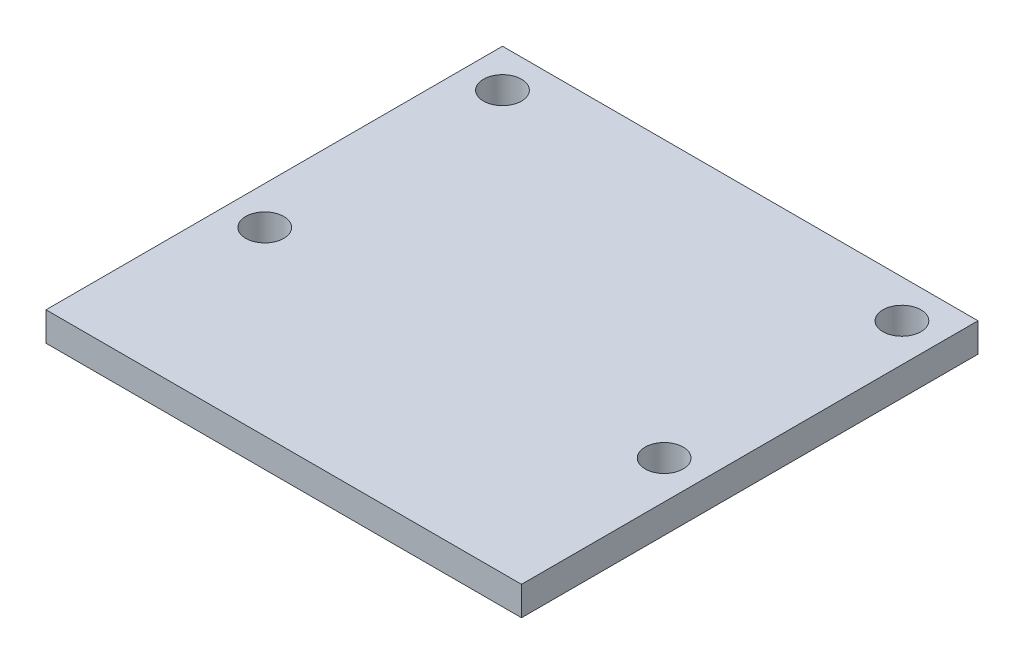
ISO-10303-21;
HEADER;
FILE_DESCRIPTION(('STEP AP214'),'2;1');
FILE_NAME('part.step','',(''),(''),'','','');
FILE_SCHEMA(('AUTOMOTIVE_DESIGN { 1 0 10303 214 1 1 1 1 }'));
ENDSEC;
DATA;
#1=APPLICATION_CONTEXT('core data for automotive mechanical design processes');
#2=APPLICATION_PROTOCOL_DEFINITION('international standard','automotive_design',2000,#1);
#3=PRODUCT_CONTEXT('',#1,'mechanical');
#4=PRODUCT('Part','Part','',(#3));
#5=PRODUCT_RELATED_PRODUCT_CATEGORY('part','',(#4));
#6=PRODUCT_DEFINITION_FORMATION('','',#4);
#7=PRODUCT_DEFINITION_CONTEXT('part definition',#1,'design');
#8=PRODUCT_DEFINITION('design','',#6,#7);
#9=PRODUCT_DEFINITION_SHAPE('','',#8);
#10=(LENGTH_UNIT() NAMED_UNIT(*) SI_UNIT(.MILLI.,.METRE.));
#11=(NAMED_UNIT(*) PLANE_ANGLE_UNIT() SI_UNIT($,.RADIAN.));
#12=(NAMED_UNIT(*) SI_UNIT($,.STERADIAN.) SOLID_ANGLE_UNIT());
#13=UNCERTAINTY_MEASURE_WITH_UNIT(LENGTH_MEASURE(1.E-05),#10,'distance_accuracy_value','');
#14=(GEOMETRIC_REPRESENTATION_CONTEXT(3) GLOBAL_UNCERTAINTY_ASSIGNED_CONTEXT((#13)) GLOBAL_UNIT_ASSIGNED_CONTEXT((#10,
#11,#12)) REPRESENTATION_CONTEXT('',''));
#15=CARTESIAN_POINT('',(0.,0.,0.));
#16=DIRECTION('',(0.,0.,1.));
#17=DIRECTION('',(1.,0.,0.));
#18=AXIS2_PLACEMENT_3D('',#15,#16,#17);
#19=CARTESIAN_POINT('',(0.,1.524,0.));
#20=DIRECTION('',(0.,-1.,0.));
#21=DIRECTION('',(0.,0.,-1.));
#22=AXIS2_PLACEMENT_3D('',#19,#20,#21);
#23=PLANE('',#22);
#24=DIRECTION('',(0.,0.,1.));
#25=VECTOR('',#24,1.);
#26=CARTESIAN_POINT('',(0.,1.524,0.));
#27=LINE('',#26,#25);
#28=CARTESIAN_POINT('',(0.,1.524,-24.));
#29=VERTEX_POINT('',#28);
#30=CARTESIAN_POINT('',(0.,1.524,0.));
#31=VERTEX_POINT('',#30);
#32=EDGE_CURVE('E84',#29,#31,#27,.T.);
#33=ORIENTED_EDGE('',*,*,#32,.T.);
#34=DIRECTION('',(1.,0.,0.));
#35=VECTOR('',#34,1.);
#36=CARTESIAN_POINT('',(0.,1.524,0.));
#37=LINE('',#36,#35);
#38=CARTESIAN_POINT('',(25.,1.524,0.));
#39=VERTEX_POINT('',#38);
#40=EDGE_CURVE('E79',#31,#39,#37,.T.);
#41=ORIENTED_EDGE('',*,*,#40,.T.);
#42=DIRECTION('',(0.,0.,-1.));
#43=VECTOR('',#42,1.);
#44=CARTESIAN_POINT('',(25.,1.524,0.));
#45=LINE('',#44,#43);
#46=CARTESIAN_POINT('',(25.,1.524,-24.));
#47=VERTEX_POINT('',#46);
#48=EDGE_CURVE('E82',#39,#47,#45,.T.);
#49=ORIENTED_EDGE('',*,*,#48,.T.);
#50=DIRECTION('',(-1.,0.,0.));
#51=VECTOR('',#50,1.);
#52=CARTESIAN_POINT('',(0.,1.524,-24.));
#53=LINE('',#52,#51);
#54=EDGE_CURVE('E49',#47,#29,#53,.T.);
#55=ORIENTED_EDGE('',*,*,#54,.T.);
#56=EDGE_LOOP('',(#33,#41,#49,#55));
#57=FACE_BOUND('',#56,.T.);
#58=CARTESIAN_POINT('',(2.,1.524,-22.));
#59=DIRECTION('',(0.,1.,0.));
#60=DIRECTION('',(0.,0.,1.));
#61=AXIS2_PLACEMENT_3D('',#58,#59,#60);
#62=CIRCLE('',#61,1.);
#63=CARTESIAN_POINT('',(2.,1.524,-23.));
#64=VERTEX_POINT('',#63);
#65=EDGE_CURVE('E99',#64,#64,#62,.T.);
#66=ORIENTED_EDGE('',*,*,#65,.F.);
#67=EDGE_LOOP('',(#66));
#68=FACE_BOUND('',#67,.T.);
#69=CARTESIAN_POINT('',(23.,1.524,-22.));
#70=DIRECTION('',(0.,1.,0.));
#71=DIRECTION('',(0.,0.,1.));
#72=AXIS2_PLACEMENT_3D('',#69,#70,#71);
#73=CIRCLE('',#72,1.);
#74=CARTESIAN_POINT('',(23.,1.524,-23.));
#75=VERTEX_POINT('',#74);
#76=EDGE_CURVE('E114',#75,#75,#73,.T.);
#77=ORIENTED_EDGE('',*,*,#76,.F.);
#78=EDGE_LOOP('',(#77));
#79=FACE_BOUND('',#78,.T.);
#80=CARTESIAN_POINT('',(23.,1.524,-9.5));
#81=DIRECTION('',(0.,1.,0.));
#82=DIRECTION('',(0.,0.,1.));
#83=AXIS2_PLACEMENT_3D('',#80,#81,#82);
#84=CIRCLE('',#83,1.);
#85=CARTESIAN_POINT('',(23.,1.524,-10.5));
#86=VERTEX_POINT('',#85);
#87=EDGE_CURVE('E120',#86,#86,#84,.T.);
#88=ORIENTED_EDGE('',*,*,#87,.F.);
#89=EDGE_LOOP('',(#88));
#90=FACE_BOUND('',#89,.T.);
#91=CARTESIAN_POINT('',(2.,1.524,-9.5));
#92=DIRECTION('',(0.,1.,0.));
#93=DIRECTION('',(0.,0.,1.));
#94=AXIS2_PLACEMENT_3D('',#91,#92,#93);
#95=CIRCLE('',#94,1.);
#96=CARTESIAN_POINT('',(2.,1.524,-10.5));
#97=VERTEX_POINT('',#96);
#98=EDGE_CURVE('E126',#97,#97,#95,.T.);
#99=ORIENTED_EDGE('',*,*,#98,.F.);
#100=EDGE_LOOP('',(#99));
#101=FACE_BOUND('',#100,.T.);
#102=ADVANCED_FACE('F32',(#57,#68,#79,#90,#101),#23,.F.);
#103=CARTESIAN_POINT('',(0.,0.,0.));
#104=DIRECTION('',(0.,-1.,0.));
#105=DIRECTION('',(0.,0.,-1.));
#106=AXIS2_PLACEMENT_3D('',#103,#104,#105);
#107=PLANE('',#106);
#108=CARTESIAN_POINT('',(23.,0.,-9.5));
#109=DIRECTION('',(0.,1.,0.));
#110=DIRECTION('',(0.,0.,1.));
#111=AXIS2_PLACEMENT_3D('',#108,#109,#110);
#112=CIRCLE('',#111,1.);
#113=CARTESIAN_POINT('',(23.,0.,-10.5));
#114=VERTEX_POINT('',#113);
#115=EDGE_CURVE('E123',#114,#114,#112,.T.);
#116=ORIENTED_EDGE('',*,*,#115,.T.);
#117=EDGE_LOOP('',(#116));
#118=FACE_BOUND('',#117,.T.);
#119=CARTESIAN_POINT('',(2.,0.,-22.));
#120=DIRECTION('',(0.,1.,0.));
#121=DIRECTION('',(0.,0.,1.));
#122=AXIS2_PLACEMENT_3D('',#119,#120,#121);
#123=CIRCLE('',#122,1.);
#124=CARTESIAN_POINT('',(2.,0.,-23.));
#125=VERTEX_POINT('',#124);
#126=EDGE_CURVE('E111',#125,#125,#123,.T.);
#127=ORIENTED_EDGE('',*,*,#126,.T.);
#128=EDGE_LOOP('',(#127));
#129=FACE_BOUND('',#128,.T.);
#130=DIRECTION('',(0.,0.,1.));
#131=VECTOR('',#130,1.);
#132=CARTESIAN_POINT('',(0.,0.,0.));
#133=LINE('',#132,#131);
#134=CARTESIAN_POINT('',(0.,0.,-24.));
#135=VERTEX_POINT('',#134);
#136=CARTESIAN_POINT('',(0.,0.,0.));
#137=VERTEX_POINT('',#136);
#138=EDGE_CURVE('E96',#135,#137,#133,.T.);
#139=ORIENTED_EDGE('',*,*,#138,.F.);
#140=DIRECTION('',(-1.,0.,0.));
#141=VECTOR('',#140,1.);
#142=CARTESIAN_POINT('',(0.,0.,-24.));
#143=LINE('',#142,#141);
#144=CARTESIAN_POINT('',(25.,0.,-24.));
#145=VERTEX_POINT('',#144);
#146=EDGE_CURVE('E72',#145,#135,#143,.T.);
#147=ORIENTED_EDGE('',*,*,#146,.F.);
#148=DIRECTION('',(0.,0.,-1.));
#149=VECTOR('',#148,1.);
#150=CARTESIAN_POINT('',(25.,0.,0.));
#151=LINE('',#150,#149);
#152=CARTESIAN_POINT('',(25.,0.,0.));
#153=VERTEX_POINT('',#152);
#154=EDGE_CURVE('E66',#153,#145,#151,.T.);
#155=ORIENTED_EDGE('',*,*,#154,.F.);
#156=DIRECTION('',(1.,0.,0.));
#157=VECTOR('',#156,1.);
#158=CARTESIAN_POINT('',(0.,0.,0.));
#159=LINE('',#158,#157);
#160=EDGE_CURVE('E88',#137,#153,#159,.T.);
#161=ORIENTED_EDGE('',*,*,#160,.F.);
#162=EDGE_LOOP('',(#139,#147,#155,#161));
#163=FACE_BOUND('',#162,.T.);
#164=CARTESIAN_POINT('',(23.,0.,-22.));
#165=DIRECTION('',(0.,1.,0.));
#166=DIRECTION('',(0.,0.,1.));
#167=AXIS2_PLACEMENT_3D('',#164,#165,#166);
#168=CIRCLE('',#167,1.);
#169=CARTESIAN_POINT('',(23.,0.,-23.));
#170=VERTEX_POINT('',#169);
#171=EDGE_CURVE('E117',#170,#170,#168,.T.);
#172=ORIENTED_EDGE('',*,*,#171,.T.);
#173=EDGE_LOOP('',(#172));
#174=FACE_BOUND('',#173,.T.);
#175=CARTESIAN_POINT('',(2.,0.,-9.5));
#176=DIRECTION('',(0.,1.,0.));
#177=DIRECTION('',(0.,0.,1.));
#178=AXIS2_PLACEMENT_3D('',#175,#176,#177);
#179=CIRCLE('',#178,1.);
#180=CARTESIAN_POINT('',(2.,0.,-10.5));
#181=VERTEX_POINT('',#180);
#182=EDGE_CURVE('E129',#181,#181,#179,.T.);
#183=ORIENTED_EDGE('',*,*,#182,.T.);
#184=EDGE_LOOP('',(#183));
#185=FACE_BOUND('',#184,.T.);
#186=ADVANCED_FACE('F107',(#118,#129,#163,#174,#185),#107,.T.);
#187=CARTESIAN_POINT('',(0.,1.524,0.));
#188=DIRECTION('',(1.,0.,0.));
#189=DIRECTION('',(0.,0.,-1.));
#190=AXIS2_PLACEMENT_3D('',#187,#188,#189);
#191=PLANE('',#190);
#192=ORIENTED_EDGE('',*,*,#138,.T.);
#193=DIRECTION('',(0.,-1.,0.));
#194=VECTOR('',#193,1.);
#195=CARTESIAN_POINT('',(0.,1.524,0.));
#196=LINE('',#195,#194);
#197=EDGE_CURVE('E11',#31,#137,#196,.T.);
#198=ORIENTED_EDGE('',*,*,#197,.F.);
#199=ORIENTED_EDGE('',*,*,#32,.F.);
#200=DIRECTION('',(0.,-1.,0.));
#201=VECTOR('',#200,1.);
#202=CARTESIAN_POINT('',(0.,1.524,-24.));
#203=LINE('',#202,#201);
#204=EDGE_CURVE('E92',#29,#135,#203,.T.);
#205=ORIENTED_EDGE('',*,*,#204,.T.);
#206=EDGE_LOOP('',(#192,#198,#199,#205));
#207=FACE_BOUND('',#206,.T.);
#208=ADVANCED_FACE('F34',(#207),#191,.F.);
#209=CARTESIAN_POINT('',(0.,1.524,0.));
#210=DIRECTION('',(0.,0.,-1.));
#211=DIRECTION('',(-1.,0.,0.));
#212=AXIS2_PLACEMENT_3D('',#209,#210,#211);
#213=PLANE('',#212);
#214=ORIENTED_EDGE('',*,*,#160,.T.);
#215=DIRECTION('',(0.,-1.,0.));
#216=VECTOR('',#215,1.);
#217=CARTESIAN_POINT('',(25.,1.524,0.));
#218=LINE('',#217,#216);
#219=EDGE_CURVE('E41',#39,#153,#218,.T.);
#220=ORIENTED_EDGE('',*,*,#219,.F.);
#221=ORIENTED_EDGE('',*,*,#40,.F.);
#222=ORIENTED_EDGE('',*,*,#197,.T.);
#223=EDGE_LOOP('',(#214,#220,#221,#222));
#224=FACE_BOUND('',#223,.T.);
#225=ADVANCED_FACE('F87',(#224),#213,.F.);
#226=CARTESIAN_POINT('',(25.,1.524,0.));
#227=DIRECTION('',(-1.,0.,0.));
#228=DIRECTION('',(0.,0.,1.));
#229=AXIS2_PLACEMENT_3D('',#226,#227,#228);
#230=PLANE('',#229);
#231=ORIENTED_EDGE('',*,*,#154,.T.);
#232=DIRECTION('',(0.,-1.,0.));
#233=VECTOR('',#232,1.);
#234=CARTESIAN_POINT('',(25.,1.524,-24.));
#235=LINE('',#234,#233);
#236=EDGE_CURVE('E89',#47,#145,#235,.T.);
#237=ORIENTED_EDGE('',*,*,#236,.F.);
#238=ORIENTED_EDGE('',*,*,#48,.F.);
#239=ORIENTED_EDGE('',*,*,#219,.T.);
#240=EDGE_LOOP('',(#231,#237,#238,#239));
#241=FACE_BOUND('',#240,.T.);
#242=ADVANCED_FACE('F90',(#241),#230,.F.);
#243=CARTESIAN_POINT('',(0.,1.524,-24.));
#244=DIRECTION('',(0.,0.,1.));
#245=DIRECTION('',(1.,0.,0.));
#246=AXIS2_PLACEMENT_3D('',#243,#244,#245);
#247=PLANE('',#246);
#248=ORIENTED_EDGE('',*,*,#146,.T.);
#249=ORIENTED_EDGE('',*,*,#204,.F.);
#250=ORIENTED_EDGE('',*,*,#54,.F.);
#251=ORIENTED_EDGE('',*,*,#236,.T.);
#252=EDGE_LOOP('',(#248,#249,#250,#251));
#253=FACE_BOUND('',#252,.T.);
#254=ADVANCED_FACE('F104',(#253),#247,.F.);
#255=CARTESIAN_POINT('',(2.,1.524,-22.));
#256=DIRECTION('',(0.,-1.,0.));
#257=DIRECTION('',(0.,0.,-1.));
#258=AXIS2_PLACEMENT_3D('',#255,#256,#257);
#259=CYLINDRICAL_SURFACE('',#258,1.);
#260=CARTESIAN_POINT('',(2.,1.524,-23.));
#261=CARTESIAN_POINT('',(2.,1.508125,-23.));
#262=CARTESIAN_POINT('',(2.,1.49225,-23.));
#263=CARTESIAN_POINT('',(2.,1.4605,-23.));
#264=CARTESIAN_POINT('',(2.,1.444625,-23.));
#265=CARTESIAN_POINT('',(2.,1.412875,-23.));
#266=CARTESIAN_POINT('',(2.,1.397,-23.));
#267=CARTESIAN_POINT('',(2.,1.36525,-23.));
#268=CARTESIAN_POINT('',(2.,1.349375,-23.));
#269=CARTESIAN_POINT('',(2.,1.317625,-23.));
#270=CARTESIAN_POINT('',(2.,1.30175,-23.));
#271=CARTESIAN_POINT('',(2.,1.27,-23.));
#272=CARTESIAN_POINT('',(2.,1.254125,-23.));
#273=CARTESIAN_POINT('',(2.,1.222375,-23.));
#274=CARTESIAN_POINT('',(2.,1.2065,-23.));
#275=CARTESIAN_POINT('',(2.,1.17475,-23.));
#276=CARTESIAN_POINT('',(2.,1.158875,-23.));
#277=CARTESIAN_POINT('',(2.,1.127125,-23.));
#278=CARTESIAN_POINT('',(2.,1.11125,-23.));
#279=CARTESIAN_POINT('',(2.,1.0795,-23.));
#280=CARTESIAN_POINT('',(2.,1.063625,-23.));
#281=CARTESIAN_POINT('',(2.,1.031875,-23.));
#282=CARTESIAN_POINT('',(2.,1.016,-23.));
#283=CARTESIAN_POINT('',(2.,0.98425,-23.));
#284=CARTESIAN_POINT('',(2.,0.968375,-23.));
#285=CARTESIAN_POINT('',(2.,0.936625,-23.));
#286=CARTESIAN_POINT('',(2.,0.92075,-23.));
#287=CARTESIAN_POINT('',(2.,0.889,-23.));
#288=CARTESIAN_POINT('',(2.,0.873125,-23.));
#289=CARTESIAN_POINT('',(2.,0.841375,-23.));
#290=CARTESIAN_POINT('',(2.,0.8255,-23.));
#291=CARTESIAN_POINT('',(2.,0.79375,-23.));
#292=CARTESIAN_POINT('',(2.,0.777875,-23.));
#293=CARTESIAN_POINT('',(2.,0.746125,-23.));
#294=CARTESIAN_POINT('',(2.,0.73025,-23.));
#295=CARTESIAN_POINT('',(2.,0.6985,-23.));
#296=CARTESIAN_POINT('',(2.,0.682625,-23.));
#297=CARTESIAN_POINT('',(2.,0.650875,-23.));
#298=CARTESIAN_POINT('',(2.,0.635,-23.));
#299=CARTESIAN_POINT('',(2.,0.60325,-23.));
#300=CARTESIAN_POINT('',(2.,0.587375,-23.));
#301=CARTESIAN_POINT('',(2.,0.555625,-23.));
#302=CARTESIAN_POINT('',(2.,0.53975,-23.));
#303=CARTESIAN_POINT('',(2.,0.508,-23.));
#304=CARTESIAN_POINT('',(2.,0.492125,-23.));
#305=CARTESIAN_POINT('',(2.,0.460375,-23.));
#306=CARTESIAN_POINT('',(2.,0.4445,-23.));
#307=CARTESIAN_POINT('',(2.,0.41275,-23.));
#308=CARTESIAN_POINT('',(2.,0.396875,-23.));
#309=CARTESIAN_POINT('',(2.,0.365125,-23.));
#310=CARTESIAN_POINT('',(2.,0.34925,-23.));
#311=CARTESIAN_POINT('',(2.,0.3175,-23.));
#312=CARTESIAN_POINT('',(2.,0.301625,-23.));
#313=CARTESIAN_POINT('',(2.,0.269875,-23.));
#314=CARTESIAN_POINT('',(2.,0.254,-23.));
#315=CARTESIAN_POINT('',(2.,0.22225,-23.));
#316=CARTESIAN_POINT('',(2.,0.206375,-23.));
#317=CARTESIAN_POINT('',(2.,0.174625,-23.));
#318=CARTESIAN_POINT('',(2.,0.15875,-23.));
#319=CARTESIAN_POINT('',(2.,0.127,-23.));
#320=CARTESIAN_POINT('',(2.,0.111125,-23.));
#321=CARTESIAN_POINT('',(2.,0.079375,-23.));
#322=CARTESIAN_POINT('',(2.,0.0635,-23.));
#323=CARTESIAN_POINT('',(2.,0.0317499999999999,-23.));
#324=CARTESIAN_POINT('',(2.,0.015875,-23.));
#325=CARTESIAN_POINT('',(2.,0.,-23.));
#326=B_SPLINE_CURVE_WITH_KNOTS('',3,(#260,#261,#262,#263,#264,#265,#266,#267,#268,#269,#270,
#271,#272,#273,#274,#275,#276,#277,#278,#279,#280,#281,#282,#283,#284,#285,#286,#287,#288,#289,
#290,#291,#292,#293,#294,#295,#296,#297,#298,#299,#300,#301,#302,#303,#304,#305,#306,#307,#308,
#309,#310,#311,#312,#313,#314,#315,#316,#317,#318,#319,#320,#321,#322,#323,#324,#325),
.UNSPECIFIED.,.F.,.F.,(4,2,2,2,2,2,2,2,2,2,2,2,2,2,2,2,2,2,2,2,2,2,2,2,2,2,2,2,2,2,2,2,4),(0.,
0.0476249999999999,0.0952499999999998,0.142875,0.1905,0.238125,0.28575,0.333375,0.381,0.428625,
0.47625,0.523875,0.5715,0.619125,0.66675,0.714375,0.762,0.809625,0.85725,0.904875,0.9525,
1.000125,1.04775,1.095375,1.143,1.190625,1.23825,1.285875,1.3335,1.381125,1.42875,1.476375,
1.524),.UNSPECIFIED.);
#327=EDGE_CURVE('BSEAM146',#64,#125,#326,.T.);
#328=ORIENTED_EDGE('',*,*,#65,.T.);
#329=ORIENTED_EDGE('',*,*,#126,.F.);
#330=ORIENTED_EDGE('',*,*,#327,.T.);
#331=ORIENTED_EDGE('',*,*,#327,.F.);
#332=EDGE_LOOP('',(#328,#330,#329,#331));
#333=FACE_BOUND('',#332,.T.);
#334=ADVANCED_FACE('F146',(#333),#259,.F.);
#335=CARTESIAN_POINT('',(23.,1.524,-22.));
#336=DIRECTION('',(0.,-1.,0.));
#337=DIRECTION('',(0.,0.,-1.));
#338=AXIS2_PLACEMENT_3D('',#335,#336,#337);
#339=CYLINDRICAL_SURFACE('',#338,1.);
#340=CARTESIAN_POINT('',(23.,1.524,-23.));
#341=CARTESIAN_POINT('',(23.,1.508125,-23.));
#342=CARTESIAN_POINT('',(23.,1.49225,-23.));
#343=CARTESIAN_POINT('',(23.,1.4605,-23.));
#344=CARTESIAN_POINT('',(23.,1.444625,-23.));
#345=CARTESIAN_POINT('',(23.,1.412875,-23.));
#346=CARTESIAN_POINT('',(23.,1.397,-23.));
#347=CARTESIAN_POINT('',(23.,1.36525,-23.));
#348=CARTESIAN_POINT('',(23.,1.349375,-23.));
#349=CARTESIAN_POINT('',(23.,1.317625,-23.));
#350=CARTESIAN_POINT('',(23.,1.30175,-23.));
#351=CARTESIAN_POINT('',(23.,1.27,-23.));
#352=CARTESIAN_POINT('',(23.,1.254125,-23.));
#353=CARTESIAN_POINT('',(23.,1.222375,-23.));
#354=CARTESIAN_POINT('',(23.,1.2065,-23.));
#355=CARTESIAN_POINT('',(23.,1.17475,-23.));
#356=CARTESIAN_POINT('',(23.,1.158875,-23.));
#357=CARTESIAN_POINT('',(23.,1.127125,-23.));
#358=CARTESIAN_POINT('',(23.,1.11125,-23.));
#359=CARTESIAN_POINT('',(23.,1.0795,-23.));
#360=CARTESIAN_POINT('',(23.,1.063625,-23.));
#361=CARTESIAN_POINT('',(23.,1.031875,-23.));
#362=CARTESIAN_POINT('',(23.,1.016,-23.));
#363=CARTESIAN_POINT('',(23.,0.98425,-23.));
#364=CARTESIAN_POINT('',(23.,0.968375,-23.));
#365=CARTESIAN_POINT('',(23.,0.936625,-23.));
#366=CARTESIAN_POINT('',(23.,0.92075,-23.));
#367=CARTESIAN_POINT('',(23.,0.889,-23.));
#368=CARTESIAN_POINT('',(23.,0.873125,-23.));
#369=CARTESIAN_POINT('',(23.,0.841375,-23.));
#370=CARTESIAN_POINT('',(23.,0.8255,-23.));
#371=CARTESIAN_POINT('',(23.,0.79375,-23.));
#372=CARTESIAN_POINT('',(23.,0.777875,-23.));
#373=CARTESIAN_POINT('',(23.,0.746125,-23.));
#374=CARTESIAN_POINT('',(23.,0.73025,-23.));
#375=CARTESIAN_POINT('',(23.,0.6985,-23.));
#376=CARTESIAN_POINT('',(23.,0.682625,-23.));
#377=CARTESIAN_POINT('',(23.,0.650875,-23.));
#378=CARTESIAN_POINT('',(23.,0.635,-23.));
#379=CARTESIAN_POINT('',(23.,0.60325,-23.));
#380=CARTESIAN_POINT('',(23.,0.587375,-23.));
#381=CARTESIAN_POINT('',(23.,0.555625,-23.));
#382=CARTESIAN_POINT('',(23.,0.53975,-23.));
#383=CARTESIAN_POINT('',(23.,0.508,-23.));
#384=CARTESIAN_POINT('',(23.,0.492125,-23.));
#385=CARTESIAN_POINT('',(23.,0.460375,-23.));
#386=CARTESIAN_POINT('',(23.,0.4445,-23.));
#387=CARTESIAN_POINT('',(23.,0.41275,-23.));
#388=CARTESIAN_POINT('',(23.,0.396875,-23.));
#389=CARTESIAN_POINT('',(23.,0.365125,-23.));
#390=CARTESIAN_POINT('',(23.,0.34925,-23.));
#391=CARTESIAN_POINT('',(23.,0.3175,-23.));
#392=CARTESIAN_POINT('',(23.,0.301625,-23.));
#393=CARTESIAN_POINT('',(23.,0.269875,-23.));
#394=CARTESIAN_POINT('',(23.,0.254,-23.));
#395=CARTESIAN_POINT('',(23.,0.22225,-23.));
#396=CARTESIAN_POINT('',(23.,0.206375,-23.));
#397=CARTESIAN_POINT('',(23.,0.174625,-23.));
#398=CARTESIAN_POINT('',(23.,0.15875,-23.));
#399=CARTESIAN_POINT('',(23.,0.127,-23.));
#400=CARTESIAN_POINT('',(23.,0.111125,-23.));
#401=CARTESIAN_POINT('',(23.,0.079375,-23.));
#402=CARTESIAN_POINT('',(23.,0.0635,-23.));
#403=CARTESIAN_POINT('',(23.,0.0317499999999999,-23.));
#404=CARTESIAN_POINT('',(23.,0.015875,-23.));
#405=CARTESIAN_POINT('',(23.,0.,-23.));
#406=B_SPLINE_CURVE_WITH_KNOTS('',3,(#340,#341,#342,#343,#344,#345,#346,#347,#348,#349,#350,
#351,#352,#353,#354,#355,#356,#357,#358,#359,#360,#361,#362,#363,#364,#365,#366,#367,#368,#369,
#370,#371,#372,#373,#374,#375,#376,#377,#378,#379,#380,#381,#382,#383,#384,#385,#386,#387,#388,
#389,#390,#391,#392,#393,#394,#395,#396,#397,#398,#399,#400,#401,#402,#403,#404,#405),
.UNSPECIFIED.,.F.,.F.,(4,2,2,2,2,2,2,2,2,2,2,2,2,2,2,2,2,2,2,2,2,2,2,2,2,2,2,2,2,2,2,2,4),(0.,
0.0476249999999999,0.0952499999999998,0.142875,0.1905,0.238125,0.28575,0.333375,0.381,0.428625,
0.47625,0.523875,0.5715,0.619125,0.66675,0.714375,0.762,0.809625,0.85725,0.904875,0.9525,
1.000125,1.04775,1.095375,1.143,1.190625,1.23825,1.285875,1.3335,1.381125,1.42875,1.476375,
1.524),.UNSPECIFIED.);
#407=EDGE_CURVE('BSEAM192',#75,#170,#406,.T.);
#408=ORIENTED_EDGE('',*,*,#76,.T.);
#409=ORIENTED_EDGE('',*,*,#171,.F.);
#410=ORIENTED_EDGE('',*,*,#407,.T.);
#411=ORIENTED_EDGE('',*,*,#407,.F.);
#412=EDGE_LOOP('',(#408,#410,#409,#411));
#413=FACE_BOUND('',#412,.T.);
#414=ADVANCED_FACE('F192',(#413),#339,.F.);
#415=CARTESIAN_POINT('',(23.,1.524,-9.5));
#416=DIRECTION('',(0.,-1.,0.));
#417=DIRECTION('',(0.,0.,-1.));
#418=AXIS2_PLACEMENT_3D('',#415,#416,#417);
#419=CYLINDRICAL_SURFACE('',#418,1.);
#420=CARTESIAN_POINT('',(23.,1.524,-10.5));
#421=CARTESIAN_POINT('',(23.,1.508125,-10.5));
#422=CARTESIAN_POINT('',(23.,1.49225,-10.5));
#423=CARTESIAN_POINT('',(23.,1.4605,-10.5));
#424=CARTESIAN_POINT('',(23.,1.444625,-10.5));
#425=CARTESIAN_POINT('',(23.,1.412875,-10.5));
#426=CARTESIAN_POINT('',(23.,1.397,-10.5));
#427=CARTESIAN_POINT('',(23.,1.36525,-10.5));
#428=CARTESIAN_POINT('',(23.,1.349375,-10.5));
#429=CARTESIAN_POINT('',(23.,1.317625,-10.5));
#430=CARTESIAN_POINT('',(23.,1.30175,-10.5));
#431=CARTESIAN_POINT('',(23.,1.27,-10.5));
#432=CARTESIAN_POINT('',(23.,1.254125,-10.5));
#433=CARTESIAN_POINT('',(23.,1.222375,-10.5));
#434=CARTESIAN_POINT('',(23.,1.2065,-10.5));
#435=CARTESIAN_POINT('',(23.,1.17475,-10.5));
#436=CARTESIAN_POINT('',(23.,1.158875,-10.5));
#437=CARTESIAN_POINT('',(23.,1.127125,-10.5));
#438=CARTESIAN_POINT('',(23.,1.11125,-10.5));
#439=CARTESIAN_POINT('',(23.,1.0795,-10.5));
#440=CARTESIAN_POINT('',(23.,1.063625,-10.5));
#441=CARTESIAN_POINT('',(23.,1.031875,-10.5));
#442=CARTESIAN_POINT('',(23.,1.016,-10.5));
#443=CARTESIAN_POINT('',(23.,0.98425,-10.5));
#444=CARTESIAN_POINT('',(23.,0.968375,-10.5));
#445=CARTESIAN_POINT('',(23.,0.936625,-10.5));
#446=CARTESIAN_POINT('',(23.,0.92075,-10.5));
#447=CARTESIAN_POINT('',(23.,0.889,-10.5));
#448=CARTESIAN_POINT('',(23.,0.873125,-10.5));
#449=CARTESIAN_POINT('',(23.,0.841375,-10.5));
#450=CARTESIAN_POINT('',(23.,0.8255,-10.5));
#451=CARTESIAN_POINT('',(23.,0.79375,-10.5));
#452=CARTESIAN_POINT('',(23.,0.777875,-10.5));
#453=CARTESIAN_POINT('',(23.,0.746125,-10.5));
#454=CARTESIAN_POINT('',(23.,0.73025,-10.5));
#455=CARTESIAN_POINT('',(23.,0.6985,-10.5));
#456=CARTESIAN_POINT('',(23.,0.682625,-10.5));
#457=CARTESIAN_POINT('',(23.,0.650875,-10.5));
#458=CARTESIAN_POINT('',(23.,0.635,-10.5));
#459=CARTESIAN_POINT('',(23.,0.60325,-10.5));
#460=CARTESIAN_POINT('',(23.,0.587375,-10.5));
#461=CARTESIAN_POINT('',(23.,0.555625,-10.5));
#462=CARTESIAN_POINT('',(23.,0.53975,-10.5));
#463=CARTESIAN_POINT('',(23.,0.508,-10.5));
#464=CARTESIAN_POINT('',(23.,0.492125,-10.5));
#465=CARTESIAN_POINT('',(23.,0.460375,-10.5));
#466=CARTESIAN_POINT('',(23.,0.4445,-10.5));
#467=CARTESIAN_POINT('',(23.,0.41275,-10.5));
#468=CARTESIAN_POINT('',(23.,0.396875,-10.5));
#469=CARTESIAN_POINT('',(23.,0.365125,-10.5));
#470=CARTESIAN_POINT('',(23.,0.34925,-10.5));
#471=CARTESIAN_POINT('',(23.,0.3175,-10.5));
#472=CARTESIAN_POINT('',(23.,0.301625,-10.5));
#473=CARTESIAN_POINT('',(23.,0.269875,-10.5));
#474=CARTESIAN_POINT('',(23.,0.254,-10.5));
#475=CARTESIAN_POINT('',(23.,0.22225,-10.5));
#476=CARTESIAN_POINT('',(23.,0.206375,-10.5));
#477=CARTESIAN_POINT('',(23.,0.174625,-10.5));
#478=CARTESIAN_POINT('',(23.,0.15875,-10.5));
#479=CARTESIAN_POINT('',(23.,0.127,-10.5));
#480=CARTESIAN_POINT('',(23.,0.111125,-10.5));
#481=CARTESIAN_POINT('',(23.,0.079375,-10.5));
#482=CARTESIAN_POINT('',(23.,0.0635,-10.5));
#483=CARTESIAN_POINT('',(23.,0.0317499999999999,-10.5));
#484=CARTESIAN_POINT('',(23.,0.015875,-10.5));
#485=CARTESIAN_POINT('',(23.,0.,-10.5));
#486=B_SPLINE_CURVE_WITH_KNOTS('',3,(#420,#421,#422,#423,#424,#425,#426,#427,#428,#429,#430,
#431,#432,#433,#434,#435,#436,#437,#438,#439,#440,#441,#442,#443,#444,#445,#446,#447,#448,#449,
#450,#451,#452,#453,#454,#455,#456,#457,#458,#459,#460,#461,#462,#463,#464,#465,#466,#467,#468,
#469,#470,#471,#472,#473,#474,#475,#476,#477,#478,#479,#480,#481,#482,#483,#484,#485),
.UNSPECIFIED.,.F.,.F.,(4,2,2,2,2,2,2,2,2,2,2,2,2,2,2,2,2,2,2,2,2,2,2,2,2,2,2,2,2,2,2,2,4),(0.,
0.0476249999999999,0.0952499999999998,0.142875,0.1905,0.238125,0.28575,0.333375,0.381,0.428625,
0.47625,0.523875,0.5715,0.619125,0.66675,0.714375,0.762,0.809625,0.85725,0.904875,0.9525,
1.000125,1.04775,1.095375,1.143,1.190625,1.23825,1.285875,1.3335,1.381125,1.42875,1.476375,
1.524),.UNSPECIFIED.);
#487=EDGE_CURVE('BSEAM200',#86,#114,#486,.T.);
#488=ORIENTED_EDGE('',*,*,#87,.T.);
#489=ORIENTED_EDGE('',*,*,#115,.F.);
#490=ORIENTED_EDGE('',*,*,#487,.T.);
#491=ORIENTED_EDGE('',*,*,#487,.F.);
#492=EDGE_LOOP('',(#488,#490,#489,#491));
#493=FACE_BOUND('',#492,.T.);
#494=ADVANCED_FACE('F200',(#493),#419,.F.);
#495=CARTESIAN_POINT('',(2.,1.524,-9.5));
#496=DIRECTION('',(0.,-1.,0.));
#497=DIRECTION('',(0.,0.,-1.));
#498=AXIS2_PLACEMENT_3D('',#495,#496,#497);
#499=CYLINDRICAL_SURFACE('',#498,1.);
#500=CARTESIAN_POINT('',(2.,1.524,-10.5));
#501=CARTESIAN_POINT('',(2.,1.508125,-10.5));
#502=CARTESIAN_POINT('',(2.,1.49225,-10.5));
#503=CARTESIAN_POINT('',(2.,1.4605,-10.5));
#504=CARTESIAN_POINT('',(2.,1.444625,-10.5));
#505=CARTESIAN_POINT('',(2.,1.412875,-10.5));
#506=CARTESIAN_POINT('',(2.,1.397,-10.5));
#507=CARTESIAN_POINT('',(2.,1.36525,-10.5));
#508=CARTESIAN_POINT('',(2.,1.349375,-10.5));
#509=CARTESIAN_POINT('',(2.,1.317625,-10.5));
#510=CARTESIAN_POINT('',(2.,1.30175,-10.5));
#511=CARTESIAN_POINT('',(2.,1.27,-10.5));
#512=CARTESIAN_POINT('',(2.,1.254125,-10.5));
#513=CARTESIAN_POINT('',(2.,1.222375,-10.5));
#514=CARTESIAN_POINT('',(2.,1.2065,-10.5));
#515=CARTESIAN_POINT('',(2.,1.17475,-10.5));
#516=CARTESIAN_POINT('',(2.,1.158875,-10.5));
#517=CARTESIAN_POINT('',(2.,1.127125,-10.5));
#518=CARTESIAN_POINT('',(2.,1.11125,-10.5));
#519=CARTESIAN_POINT('',(2.,1.0795,-10.5));
#520=CARTESIAN_POINT('',(2.,1.063625,-10.5));
#521=CARTESIAN_POINT('',(2.,1.031875,-10.5));
#522=CARTESIAN_POINT('',(2.,1.016,-10.5));
#523=CARTESIAN_POINT('',(2.,0.98425,-10.5));
#524=CARTESIAN_POINT('',(2.,0.968375,-10.5));
#525=CARTESIAN_POINT('',(2.,0.936625,-10.5));
#526=CARTESIAN_POINT('',(2.,0.92075,-10.5));
#527=CARTESIAN_POINT('',(2.,0.889,-10.5));
#528=CARTESIAN_POINT('',(2.,0.873125,-10.5));
#529=CARTESIAN_POINT('',(2.,0.841375,-10.5));
#530=CARTESIAN_POINT('',(2.,0.8255,-10.5));
#531=CARTESIAN_POINT('',(2.,0.79375,-10.5));
#532=CARTESIAN_POINT('',(2.,0.777875,-10.5));
#533=CARTESIAN_POINT('',(2.,0.746125,-10.5));
#534=CARTESIAN_POINT('',(2.,0.73025,-10.5));
#535=CARTESIAN_POINT('',(2.,0.6985,-10.5));
#536=CARTESIAN_POINT('',(2.,0.682625,-10.5));
#537=CARTESIAN_POINT('',(2.,0.650875,-10.5));
#538=CARTESIAN_POINT('',(2.,0.635,-10.5));
#539=CARTESIAN_POINT('',(2.,0.60325,-10.5));
#540=CARTESIAN_POINT('',(2.,0.587375,-10.5));
#541=CARTESIAN_POINT('',(2.,0.555625,-10.5));
#542=CARTESIAN_POINT('',(2.,0.53975,-10.5));
#543=CARTESIAN_POINT('',(2.,0.508,-10.5));
#544=CARTESIAN_POINT('',(2.,0.492125,-10.5));
#545=CARTESIAN_POINT('',(2.,0.460375,-10.5));
#546=CARTESIAN_POINT('',(2.,0.4445,-10.5));
#547=CARTESIAN_POINT('',(2.,0.41275,-10.5));
#548=CARTESIAN_POINT('',(2.,0.396875,-10.5));
#549=CARTESIAN_POINT('',(2.,0.365125,-10.5));
#550=CARTESIAN_POINT('',(2.,0.34925,-10.5));
#551=CARTESIAN_POINT('',(2.,0.3175,-10.5));
#552=CARTESIAN_POINT('',(2.,0.301625,-10.5));
#553=CARTESIAN_POINT('',(2.,0.269875,-10.5));
#554=CARTESIAN_POINT('',(2.,0.254,-10.5));
#555=CARTESIAN_POINT('',(2.,0.22225,-10.5));
#556=CARTESIAN_POINT('',(2.,0.206375,-10.5));
#557=CARTESIAN_POINT('',(2.,0.174625,-10.5));
#558=CARTESIAN_POINT('',(2.,0.15875,-10.5));
#559=CARTESIAN_POINT('',(2.,0.127,-10.5));
#560=CARTESIAN_POINT('',(2.,0.111125,-10.5));
#561=CARTESIAN_POINT('',(2.,0.079375,-10.5));
#562=CARTESIAN_POINT('',(2.,0.0635,-10.5));
#563=CARTESIAN_POINT('',(2.,0.0317499999999999,-10.5));
#564=CARTESIAN_POINT('',(2.,0.015875,-10.5));
#565=CARTESIAN_POINT('',(2.,0.,-10.5));
#566=B_SPLINE_CURVE_WITH_KNOTS('',3,(#500,#501,#502,#503,#504,#505,#506,#507,#508,#509,#510,
#511,#512,#513,#514,#515,#516,#517,#518,#519,#520,#521,#522,#523,#524,#525,#526,#527,#528,#529,
#530,#531,#532,#533,#534,#535,#536,#537,#538,#539,#540,#541,#542,#543,#544,#545,#546,#547,#548,
#549,#550,#551,#552,#553,#554,#555,#556,#557,#558,#559,#560,#561,#562,#563,#564,#565),
.UNSPECIFIED.,.F.,.F.,(4,2,2,2,2,2,2,2,2,2,2,2,2,2,2,2,2,2,2,2,2,2,2,2,2,2,2,2,2,2,2,2,4),(0.,
0.0476249999999999,0.0952499999999998,0.142875,0.1905,0.238125,0.28575,0.333375,0.381,0.428625,
0.47625,0.523875,0.5715,0.619125,0.66675,0.714375,0.762,0.809625,0.85725,0.904875,0.9525,
1.000125,1.04775,1.095375,1.143,1.190625,1.23825,1.285875,1.3335,1.381125,1.42875,1.476375,
1.524),.UNSPECIFIED.);
#567=EDGE_CURVE('BSEAM135',#97,#181,#566,.T.);
#568=ORIENTED_EDGE('',*,*,#98,.T.);
#569=ORIENTED_EDGE('',*,*,#182,.F.);
#570=ORIENTED_EDGE('',*,*,#567,.T.);
#571=ORIENTED_EDGE('',*,*,#567,.F.);
#572=EDGE_LOOP('',(#568,#570,#569,#571));
#573=FACE_BOUND('',#572,.T.);
#574=ADVANCED_FACE('F135',(#573),#499,.F.);
#575=CLOSED_SHELL('',(#102,#186,#208,#225,#242,#254,#334,#414,#494,#574));
#576=MANIFOLD_SOLID_BREP('B2',#575);
#577=ADVANCED_BREP_SHAPE_REPRESENTATION('',(#18,#576),#14);
#578=SHAPE_DEFINITION_REPRESENTATION(#9,#577);
ENDSEC;
END-ISO-10303-21;
